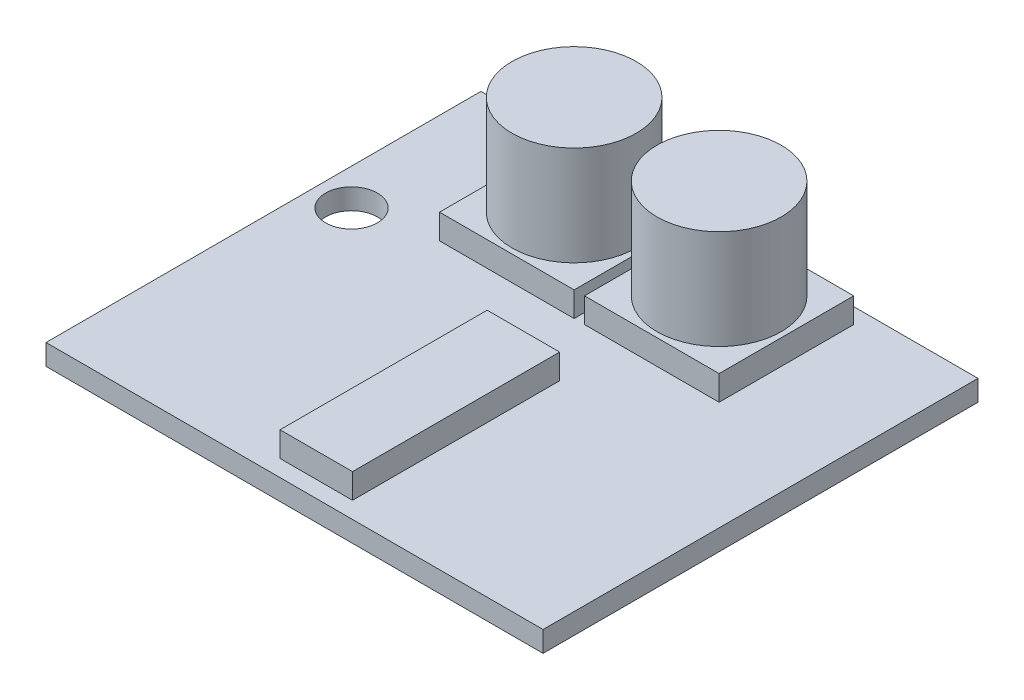
ISO-10303-21;
HEADER;
FILE_DESCRIPTION(('STEP AP214'),'2;1');
FILE_NAME('part.step','',(''),(''),'','','');
FILE_SCHEMA(('AUTOMOTIVE_DESIGN { 1 0 10303 214 1 1 1 1 }'));
ENDSEC;
DATA;
#1=APPLICATION_CONTEXT('core data for automotive mechanical design processes');
#2=APPLICATION_PROTOCOL_DEFINITION('international standard','automotive_design',2000,#1);
#3=PRODUCT_CONTEXT('',#1,'mechanical');
#4=PRODUCT('Part','Part','',(#3));
#5=PRODUCT_RELATED_PRODUCT_CATEGORY('part','',(#4));
#6=PRODUCT_DEFINITION_FORMATION('','',#4);
#7=PRODUCT_DEFINITION_CONTEXT('part definition',#1,'design');
#8=PRODUCT_DEFINITION('design','',#6,#7);
#9=PRODUCT_DEFINITION_SHAPE('','',#8);
#10=(LENGTH_UNIT() NAMED_UNIT(*) SI_UNIT(.MILLI.,.METRE.));
#11=(NAMED_UNIT(*) PLANE_ANGLE_UNIT() SI_UNIT($,.RADIAN.));
#12=(NAMED_UNIT(*) SI_UNIT($,.STERADIAN.) SOLID_ANGLE_UNIT());
#13=UNCERTAINTY_MEASURE_WITH_UNIT(LENGTH_MEASURE(1.E-05),#10,'distance_accuracy_value','');
#14=(GEOMETRIC_REPRESENTATION_CONTEXT(3) GLOBAL_UNCERTAINTY_ASSIGNED_CONTEXT((#13)) GLOBAL_UNIT_ASSIGNED_CONTEXT((#10,
#11,#12)) REPRESENTATION_CONTEXT('',''));
#15=CARTESIAN_POINT('',(0.,0.,0.));
#16=DIRECTION('',(0.,0.,1.));
#17=DIRECTION('',(1.,0.,0.));
#18=AXIS2_PLACEMENT_3D('',#15,#16,#17);
#19=CARTESIAN_POINT('',(0.,1.,0.));
#20=DIRECTION('',(0.,1.,0.));
#21=DIRECTION('',(0.,0.,1.));
#22=AXIS2_PLACEMENT_3D('',#19,#20,#21);
#23=PLANE('',#22);
#24=DIRECTION('',(1.,0.,0.));
#25=VECTOR('',#24,1.);
#26=CARTESIAN_POINT('',(-0.250000000000006,1.,-3.25));
#27=LINE('',#26,#25);
#28=CARTESIAN_POINT('',(-6.75000000000001,1.,-3.25));
#29=VERTEX_POINT('',#28);
#30=CARTESIAN_POINT('',(-0.250000000000006,1.,-3.25));
#31=VERTEX_POINT('',#30);
#32=EDGE_CURVE('E247',#29,#31,#27,.T.);
#33=ORIENTED_EDGE('',*,*,#32,.F.);
#34=DIRECTION('',(0.,0.,1.));
#35=VECTOR('',#34,1.);
#36=CARTESIAN_POINT('',(-6.75000000000001,1.,-3.25));
#37=LINE('',#36,#35);
#38=CARTESIAN_POINT('',(-6.75000000000001,1.,-9.75));
#39=VERTEX_POINT('',#38);
#40=EDGE_CURVE('E243',#39,#29,#37,.T.);
#41=ORIENTED_EDGE('',*,*,#40,.F.);
#42=DIRECTION('',(-1.,0.,0.));
#43=VECTOR('',#42,1.);
#44=CARTESIAN_POINT('',(-0.250000000000006,1.,-9.75));
#45=LINE('',#44,#43);
#46=CARTESIAN_POINT('',(-0.250000000000006,1.,-9.75));
#47=VERTEX_POINT('',#46);
#48=EDGE_CURVE('E233',#47,#39,#45,.T.);
#49=ORIENTED_EDGE('',*,*,#48,.F.);
#50=DIRECTION('',(0.,0.,-1.));
#51=VECTOR('',#50,1.);
#52=CARTESIAN_POINT('',(-0.250000000000006,1.,-3.25));
#53=LINE('',#52,#51);
#54=EDGE_CURVE('E250',#31,#47,#53,.T.);
#55=ORIENTED_EDGE('',*,*,#54,.F.);
#56=EDGE_LOOP('',(#33,#41,#49,#55));
#57=FACE_BOUND('',#56,.T.);
#58=DIRECTION('',(0.,0.,1.));
#59=VECTOR('',#58,1.);
#60=CARTESIAN_POINT('',(-12.,1.,10.5));
#61=LINE('',#60,#59);
#62=CARTESIAN_POINT('',(-12.,1.,-10.5));
#63=VERTEX_POINT('',#62);
#64=CARTESIAN_POINT('',(-12.,1.,10.5));
#65=VERTEX_POINT('',#64);
#66=EDGE_CURVE('E287',#63,#65,#61,.T.);
#67=ORIENTED_EDGE('',*,*,#66,.T.);
#68=DIRECTION('',(1.,0.,0.));
#69=VECTOR('',#68,1.);
#70=CARTESIAN_POINT('',(12.,1.,10.5));
#71=LINE('',#70,#69);
#72=CARTESIAN_POINT('',(12.,1.,10.5));
#73=VERTEX_POINT('',#72);
#74=EDGE_CURVE('E291',#65,#73,#71,.T.);
#75=ORIENTED_EDGE('',*,*,#74,.T.);
#76=DIRECTION('',(0.,0.,-1.));
#77=VECTOR('',#76,1.);
#78=CARTESIAN_POINT('',(12.,1.,10.5));
#79=LINE('',#78,#77);
#80=CARTESIAN_POINT('',(12.,1.,-10.5));
#81=VERTEX_POINT('',#80);
#82=EDGE_CURVE('E295',#73,#81,#79,.T.);
#83=ORIENTED_EDGE('',*,*,#82,.T.);
#84=DIRECTION('',(-1.,0.,0.));
#85=VECTOR('',#84,1.);
#86=CARTESIAN_POINT('',(12.,1.,-10.5));
#87=LINE('',#86,#85);
#88=EDGE_CURVE('E298',#81,#63,#87,.T.);
#89=ORIENTED_EDGE('',*,*,#88,.T.);
#90=EDGE_LOOP('',(#67,#75,#83,#89));
#91=FACE_BOUND('',#90,.T.);
#92=CARTESIAN_POINT('',(-10.25,1.,-2.5));
#93=DIRECTION('',(0.,1.,0.));
#94=DIRECTION('',(0.,0.,1.));
#95=AXIS2_PLACEMENT_3D('',#92,#93,#94);
#96=CIRCLE('',#95,1.25);
#97=CARTESIAN_POINT('',(-10.25,1.,-1.25));
#98=VERTEX_POINT('',#97);
#99=EDGE_CURVE('E279',#98,#98,#96,.T.);
#100=ORIENTED_EDGE('',*,*,#99,.F.);
#101=EDGE_LOOP('',(#100));
#102=FACE_BOUND('',#101,.T.);
#103=DIRECTION('',(1.,0.,0.));
#104=VECTOR('',#103,1.);
#105=CARTESIAN_POINT('',(6.74999999999999,1.,-3.25));
#106=LINE('',#105,#104);
#107=CARTESIAN_POINT('',(0.249999999999995,1.,-3.25));
#108=VERTEX_POINT('',#107);
#109=CARTESIAN_POINT('',(6.74999999999999,1.,-3.25));
#110=VERTEX_POINT('',#109);
#111=EDGE_CURVE('E189',#108,#110,#106,.T.);
#112=ORIENTED_EDGE('',*,*,#111,.F.);
#113=DIRECTION('',(0.,0.,1.));
#114=VECTOR('',#113,1.);
#115=CARTESIAN_POINT('',(0.249999999999995,1.,-3.25));
#116=LINE('',#115,#114);
#117=CARTESIAN_POINT('',(0.249999999999995,1.,-9.75));
#118=VERTEX_POINT('',#117);
#119=EDGE_CURVE('E184',#118,#108,#116,.T.);
#120=ORIENTED_EDGE('',*,*,#119,.F.);
#121=DIRECTION('',(-1.,0.,0.));
#122=VECTOR('',#121,1.);
#123=CARTESIAN_POINT('',(6.74999999999999,1.,-9.75));
#124=LINE('',#123,#122);
#125=CARTESIAN_POINT('',(6.74999999999999,1.,-9.75));
#126=VERTEX_POINT('',#125);
#127=EDGE_CURVE('E199',#126,#118,#124,.T.);
#128=ORIENTED_EDGE('',*,*,#127,.F.);
#129=DIRECTION('',(0.,0.,-1.));
#130=VECTOR('',#129,1.);
#131=CARTESIAN_POINT('',(6.74999999999999,1.,-3.25));
#132=LINE('',#131,#130);
#133=EDGE_CURVE('E211',#110,#126,#132,.T.);
#134=ORIENTED_EDGE('',*,*,#133,.F.);
#135=EDGE_LOOP('',(#112,#120,#128,#134));
#136=FACE_BOUND('',#135,.T.);
#137=DIRECTION('',(1.,0.,0.));
#138=VECTOR('',#137,1.);
#139=CARTESIAN_POINT('',(-1.5,1.,9.7));
#140=LINE('',#139,#138);
#141=CARTESIAN_POINT('',(-1.5,1.,9.7));
#142=VERTEX_POINT('',#141);
#143=CARTESIAN_POINT('',(2.,1.,9.7));
#144=VERTEX_POINT('',#143);
#145=EDGE_CURVE('E368',#142,#144,#140,.T.);
#146=ORIENTED_EDGE('',*,*,#145,.F.);
#147=DIRECTION('',(0.,0.,1.));
#148=VECTOR('',#147,1.);
#149=CARTESIAN_POINT('',(-1.5,1.,9.7));
#150=LINE('',#149,#148);
#151=CARTESIAN_POINT('',(-1.5,1.,-0.299999999999998));
#152=VERTEX_POINT('',#151);
#153=EDGE_CURVE('E181',#152,#142,#150,.T.);
#154=ORIENTED_EDGE('',*,*,#153,.F.);
#155=DIRECTION('',(-1.,0.,0.));
#156=VECTOR('',#155,1.);
#157=CARTESIAN_POINT('',(-1.5,1.,-0.299999999999998));
#158=LINE('',#157,#156);
#159=CARTESIAN_POINT('',(2.,1.,-0.299999999999998));
#160=VERTEX_POINT('',#159);
#161=EDGE_CURVE('E177',#160,#152,#158,.T.);
#162=ORIENTED_EDGE('',*,*,#161,.F.);
#163=DIRECTION('',(0.,0.,-1.));
#164=VECTOR('',#163,1.);
#165=CARTESIAN_POINT('',(2.,1.,9.7));
#166=LINE('',#165,#164);
#167=EDGE_CURVE('E370',#144,#160,#166,.T.);
#168=ORIENTED_EDGE('',*,*,#167,.F.);
#169=EDGE_LOOP('',(#146,#154,#162,#168));
#170=FACE_BOUND('',#169,.T.);
#171=ADVANCED_FACE('F39',(#57,#91,#102,#136,#170),#23,.T.);
#172=CARTESIAN_POINT('',(0.,0.,0.));
#173=DIRECTION('',(0.,1.,0.));
#174=DIRECTION('',(0.,0.,1.));
#175=AXIS2_PLACEMENT_3D('',#172,#173,#174);
#176=PLANE('',#175);
#177=DIRECTION('',(0.,0.,1.));
#178=VECTOR('',#177,1.);
#179=CARTESIAN_POINT('',(-12.,0.,10.5));
#180=LINE('',#179,#178);
#181=CARTESIAN_POINT('',(-12.,0.,-10.5));
#182=VERTEX_POINT('',#181);
#183=CARTESIAN_POINT('',(-12.,0.,10.5));
#184=VERTEX_POINT('',#183);
#185=EDGE_CURVE('E283',#182,#184,#180,.T.);
#186=ORIENTED_EDGE('',*,*,#185,.F.);
#187=DIRECTION('',(-1.,0.,0.));
#188=VECTOR('',#187,1.);
#189=CARTESIAN_POINT('',(12.,0.,-10.5));
#190=LINE('',#189,#188);
#191=CARTESIAN_POINT('',(12.,0.,-10.5));
#192=VERTEX_POINT('',#191);
#193=EDGE_CURVE('E292',#192,#182,#190,.T.);
#194=ORIENTED_EDGE('',*,*,#193,.F.);
#195=DIRECTION('',(0.,0.,-1.));
#196=VECTOR('',#195,1.);
#197=CARTESIAN_POINT('',(12.,0.,10.5));
#198=LINE('',#197,#196);
#199=CARTESIAN_POINT('',(12.,0.,10.5));
#200=VERTEX_POINT('',#199);
#201=EDGE_CURVE('E308',#200,#192,#198,.T.);
#202=ORIENTED_EDGE('',*,*,#201,.F.);
#203=DIRECTION('',(1.,0.,0.));
#204=VECTOR('',#203,1.);
#205=CARTESIAN_POINT('',(12.,0.,10.5));
#206=LINE('',#205,#204);
#207=EDGE_CURVE('E305',#184,#200,#206,.T.);
#208=ORIENTED_EDGE('',*,*,#207,.F.);
#209=EDGE_LOOP('',(#186,#194,#202,#208));
#210=FACE_BOUND('',#209,.T.);
#211=CARTESIAN_POINT('',(-10.25,0.,-2.5));
#212=DIRECTION('',(0.,1.,0.));
#213=DIRECTION('',(0.,0.,1.));
#214=AXIS2_PLACEMENT_3D('',#211,#212,#213);
#215=CIRCLE('',#214,1.25);
#216=CARTESIAN_POINT('',(-10.25,0.,-1.25));
#217=VERTEX_POINT('',#216);
#218=EDGE_CURVE('E278',#217,#217,#215,.T.);
#219=ORIENTED_EDGE('',*,*,#218,.T.);
#220=EDGE_LOOP('',(#219));
#221=FACE_BOUND('',#220,.T.);
#222=ADVANCED_FACE('F356',(#210,#221),#176,.F.);
#223=CARTESIAN_POINT('',(-12.,1.,10.5));
#224=DIRECTION('',(1.,0.,0.));
#225=DIRECTION('',(0.,0.,-1.));
#226=AXIS2_PLACEMENT_3D('',#223,#224,#225);
#227=PLANE('',#226);
#228=ORIENTED_EDGE('',*,*,#185,.T.);
#229=DIRECTION('',(0.,-1.,0.));
#230=VECTOR('',#229,1.);
#231=CARTESIAN_POINT('',(-12.,1.,10.5));
#232=LINE('',#231,#230);
#233=EDGE_CURVE('E11',#65,#184,#232,.T.);
#234=ORIENTED_EDGE('',*,*,#233,.F.);
#235=ORIENTED_EDGE('',*,*,#66,.F.);
#236=DIRECTION('',(0.,-1.,0.));
#237=VECTOR('',#236,1.);
#238=CARTESIAN_POINT('',(-12.,1.,-10.5));
#239=LINE('',#238,#237);
#240=EDGE_CURVE('E301',#63,#182,#239,.T.);
#241=ORIENTED_EDGE('',*,*,#240,.T.);
#242=EDGE_LOOP('',(#228,#234,#235,#241));
#243=FACE_BOUND('',#242,.T.);
#244=ADVANCED_FACE('F41',(#243),#227,.F.);
#245=CARTESIAN_POINT('',(12.,1.,10.5));
#246=DIRECTION('',(0.,0.,-1.));
#247=DIRECTION('',(-1.,0.,0.));
#248=AXIS2_PLACEMENT_3D('',#245,#246,#247);
#249=PLANE('',#248);
#250=ORIENTED_EDGE('',*,*,#207,.T.);
#251=DIRECTION('',(0.,-1.,0.));
#252=VECTOR('',#251,1.);
#253=CARTESIAN_POINT('',(12.,1.,10.5));
#254=LINE('',#253,#252);
#255=EDGE_CURVE('E49',#73,#200,#254,.T.);
#256=ORIENTED_EDGE('',*,*,#255,.F.);
#257=ORIENTED_EDGE('',*,*,#74,.F.);
#258=ORIENTED_EDGE('',*,*,#233,.T.);
#259=EDGE_LOOP('',(#250,#256,#257,#258));
#260=FACE_BOUND('',#259,.T.);
#261=ADVANCED_FACE('F456',(#260),#249,.F.);
#262=CARTESIAN_POINT('',(12.,1.,10.5));
#263=DIRECTION('',(-1.,0.,0.));
#264=DIRECTION('',(0.,0.,1.));
#265=AXIS2_PLACEMENT_3D('',#262,#263,#264);
#266=PLANE('',#265);
#267=ORIENTED_EDGE('',*,*,#201,.T.);
#268=DIRECTION('',(0.,-1.,0.));
#269=VECTOR('',#268,1.);
#270=CARTESIAN_POINT('',(12.,1.,-10.5));
#271=LINE('',#270,#269);
#272=EDGE_CURVE('E316',#81,#192,#271,.T.);
#273=ORIENTED_EDGE('',*,*,#272,.F.);
#274=ORIENTED_EDGE('',*,*,#82,.F.);
#275=ORIENTED_EDGE('',*,*,#255,.T.);
#276=EDGE_LOOP('',(#267,#273,#274,#275));
#277=FACE_BOUND('',#276,.T.);
#278=ADVANCED_FACE('F453',(#277),#266,.F.);
#279=CARTESIAN_POINT('',(12.,1.,-10.5));
#280=DIRECTION('',(0.,0.,1.));
#281=DIRECTION('',(1.,0.,0.));
#282=AXIS2_PLACEMENT_3D('',#279,#280,#281);
#283=PLANE('',#282);
#284=ORIENTED_EDGE('',*,*,#193,.T.);
#285=ORIENTED_EDGE('',*,*,#240,.F.);
#286=ORIENTED_EDGE('',*,*,#88,.F.);
#287=ORIENTED_EDGE('',*,*,#272,.T.);
#288=EDGE_LOOP('',(#284,#285,#286,#287));
#289=FACE_BOUND('',#288,.T.);
#290=ADVANCED_FACE('F445',(#289),#283,.F.);
#291=CARTESIAN_POINT('',(-10.25,1.,-2.5));
#292=DIRECTION('',(0.,-1.,0.));
#293=DIRECTION('',(0.,0.,-1.));
#294=AXIS2_PLACEMENT_3D('',#291,#292,#293);
#295=CYLINDRICAL_SURFACE('',#294,1.25);
#296=ORIENTED_EDGE('',*,*,#99,.T.);
#297=EDGE_LOOP('',(#296));
#298=FACE_BOUND('',#297,.T.);
#299=ORIENTED_EDGE('',*,*,#218,.F.);
#300=EDGE_LOOP('',(#299));
#301=FACE_BOUND('',#300,.T.);
#302=ADVANCED_FACE('F432',(#298,#301),#295,.F.);
#303=CARTESIAN_POINT('',(-6.75000000000001,2.2,-3.25));
#304=DIRECTION('',(1.,0.,0.));
#305=DIRECTION('',(0.,0.,-1.));
#306=AXIS2_PLACEMENT_3D('',#303,#304,#305);
#307=PLANE('',#306);
#308=ORIENTED_EDGE('',*,*,#40,.T.);
#309=DIRECTION('',(0.,-1.,0.));
#310=VECTOR('',#309,1.);
#311=CARTESIAN_POINT('',(-6.75000000000001,2.2,-3.25));
#312=LINE('',#311,#310);
#313=CARTESIAN_POINT('',(-6.75000000000001,2.2,-3.25));
#314=VERTEX_POINT('',#313);
#315=EDGE_CURVE('E266',#314,#29,#312,.T.);
#316=ORIENTED_EDGE('',*,*,#315,.F.);
#317=DIRECTION('',(0.,0.,1.));
#318=VECTOR('',#317,1.);
#319=CARTESIAN_POINT('',(-6.75000000000001,2.2,-3.25));
#320=LINE('',#319,#318);
#321=CARTESIAN_POINT('',(-6.75000000000001,2.2,-9.75));
#322=VERTEX_POINT('',#321);
#323=EDGE_CURVE('E228',#322,#314,#320,.T.);
#324=ORIENTED_EDGE('',*,*,#323,.F.);
#325=DIRECTION('',(0.,-1.,0.));
#326=VECTOR('',#325,1.);
#327=CARTESIAN_POINT('',(-6.75000000000001,2.2,-9.75));
#328=LINE('',#327,#326);
#329=EDGE_CURVE('E242',#322,#39,#328,.T.);
#330=ORIENTED_EDGE('',*,*,#329,.T.);
#331=EDGE_LOOP('',(#308,#316,#324,#330));
#332=FACE_BOUND('',#331,.T.);
#333=ADVANCED_FACE('F341',(#332),#307,.F.);
#334=CARTESIAN_POINT('',(-0.250000000000006,2.2,-3.25));
#335=DIRECTION('',(0.,0.,-1.));
#336=DIRECTION('',(-1.,0.,0.));
#337=AXIS2_PLACEMENT_3D('',#334,#335,#336);
#338=PLANE('',#337);
#339=ORIENTED_EDGE('',*,*,#32,.T.);
#340=DIRECTION('',(0.,-1.,0.));
#341=VECTOR('',#340,1.);
#342=CARTESIAN_POINT('',(-0.250000000000006,2.2,-3.25));
#343=LINE('',#342,#341);
#344=CARTESIAN_POINT('',(-0.250000000000006,2.2,-3.25));
#345=VERTEX_POINT('',#344);
#346=EDGE_CURVE('E262',#345,#31,#343,.T.);
#347=ORIENTED_EDGE('',*,*,#346,.F.);
#348=DIRECTION('',(1.,0.,0.));
#349=VECTOR('',#348,1.);
#350=CARTESIAN_POINT('',(-0.250000000000006,2.2,-3.25));
#351=LINE('',#350,#349);
#352=EDGE_CURVE('E232',#314,#345,#351,.T.);
#353=ORIENTED_EDGE('',*,*,#352,.F.);
#354=ORIENTED_EDGE('',*,*,#315,.T.);
#355=EDGE_LOOP('',(#339,#347,#353,#354));
#356=FACE_BOUND('',#355,.T.);
#357=ADVANCED_FACE('F345',(#356),#338,.F.);
#358=CARTESIAN_POINT('',(-0.250000000000006,2.2,-3.25));
#359=DIRECTION('',(-1.,0.,0.));
#360=DIRECTION('',(0.,0.,1.));
#361=AXIS2_PLACEMENT_3D('',#358,#359,#360);
#362=PLANE('',#361);
#363=ORIENTED_EDGE('',*,*,#54,.T.);
#364=DIRECTION('',(0.,-1.,0.));
#365=VECTOR('',#364,1.);
#366=CARTESIAN_POINT('',(-0.250000000000006,2.2,-9.75));
#367=LINE('',#366,#365);
#368=CARTESIAN_POINT('',(-0.250000000000006,2.2,-9.75));
#369=VERTEX_POINT('',#368);
#370=EDGE_CURVE('E259',#369,#47,#367,.T.);
#371=ORIENTED_EDGE('',*,*,#370,.F.);
#372=DIRECTION('',(0.,0.,-1.));
#373=VECTOR('',#372,1.);
#374=CARTESIAN_POINT('',(-0.250000000000006,2.2,-3.25));
#375=LINE('',#374,#373);
#376=EDGE_CURVE('E236',#345,#369,#375,.T.);
#377=ORIENTED_EDGE('',*,*,#376,.F.);
#378=ORIENTED_EDGE('',*,*,#346,.T.);
#379=EDGE_LOOP('',(#363,#371,#377,#378));
#380=FACE_BOUND('',#379,.T.);
#381=ADVANCED_FACE('F350',(#380),#362,.F.);
#382=CARTESIAN_POINT('',(-0.250000000000006,2.2,-9.75));
#383=DIRECTION('',(0.,0.,1.));
#384=DIRECTION('',(1.,0.,0.));
#385=AXIS2_PLACEMENT_3D('',#382,#383,#384);
#386=PLANE('',#385);
#387=ORIENTED_EDGE('',*,*,#48,.T.);
#388=ORIENTED_EDGE('',*,*,#329,.F.);
#389=DIRECTION('',(-1.,0.,0.));
#390=VECTOR('',#389,1.);
#391=CARTESIAN_POINT('',(-0.250000000000006,2.2,-9.75));
#392=LINE('',#391,#390);
#393=EDGE_CURVE('E239',#369,#322,#392,.T.);
#394=ORIENTED_EDGE('',*,*,#393,.F.);
#395=ORIENTED_EDGE('',*,*,#370,.T.);
#396=EDGE_LOOP('',(#387,#388,#394,#395));
#397=FACE_BOUND('',#396,.T.);
#398=ADVANCED_FACE('F333',(#397),#386,.F.);
#399=CARTESIAN_POINT('',(0.,2.2,0.));
#400=DIRECTION('',(0.,1.,0.));
#401=DIRECTION('',(0.,0.,1.));
#402=AXIS2_PLACEMENT_3D('',#399,#400,#401);
#403=PLANE('',#402);
#404=CARTESIAN_POINT('',(-3.50000000000001,2.2,-6.5));
#405=DIRECTION('',(0.,1.,0.));
#406=DIRECTION('',(0.,0.,1.));
#407=AXIS2_PLACEMENT_3D('',#404,#405,#406);
#408=CIRCLE('',#407,3.);
#409=CARTESIAN_POINT('',(-3.50000000000001,2.2,-3.5));
#410=VERTEX_POINT('',#409);
#411=EDGE_CURVE('E269',#410,#410,#408,.T.);
#412=ORIENTED_EDGE('',*,*,#411,.F.);
#413=EDGE_LOOP('',(#412));
#414=FACE_BOUND('',#413,.T.);
#415=ORIENTED_EDGE('',*,*,#323,.T.);
#416=ORIENTED_EDGE('',*,*,#352,.T.);
#417=ORIENTED_EDGE('',*,*,#376,.T.);
#418=ORIENTED_EDGE('',*,*,#393,.T.);
#419=EDGE_LOOP('',(#415,#416,#417,#418));
#420=FACE_BOUND('',#419,.T.);
#421=ADVANCED_FACE('F329',(#414,#420),#403,.T.);
#422=CARTESIAN_POINT('',(-3.50000000000001,7.,-6.5));
#423=DIRECTION('',(0.,1.,0.));
#424=DIRECTION('',(0.,0.,1.));
#425=AXIS2_PLACEMENT_3D('',#422,#423,#424);
#426=PLANE('',#425);
#427=CARTESIAN_POINT('',(-3.50000000000001,7.,-6.5));
#428=DIRECTION('',(0.,1.,0.));
#429=DIRECTION('',(0.,0.,1.));
#430=AXIS2_PLACEMENT_3D('',#427,#428,#429);
#431=CIRCLE('',#430,3.);
#432=CARTESIAN_POINT('',(-3.50000000000001,7.,-3.5));
#433=VERTEX_POINT('',#432);
#434=EDGE_CURVE('E270',#433,#433,#431,.T.);
#435=ORIENTED_EDGE('',*,*,#434,.T.);
#436=EDGE_LOOP('',(#435));
#437=FACE_BOUND('',#436,.T.);
#438=ADVANCED_FACE('F332',(#437),#426,.T.);
#439=CARTESIAN_POINT('',(-3.50000000000001,7.,-6.5));
#440=DIRECTION('',(0.,-1.,0.));
#441=DIRECTION('',(0.,0.,-1.));
#442=AXIS2_PLACEMENT_3D('',#439,#440,#441);
#443=CYLINDRICAL_SURFACE('',#442,3.);
#444=ORIENTED_EDGE('',*,*,#411,.T.);
#445=EDGE_LOOP('',(#444));
#446=FACE_BOUND('',#445,.T.);
#447=ORIENTED_EDGE('',*,*,#434,.F.);
#448=EDGE_LOOP('',(#447));
#449=FACE_BOUND('',#448,.T.);
#450=ADVANCED_FACE('F326',(#446,#449),#443,.T.);
#451=CARTESIAN_POINT('',(0.249999999999995,2.2,-3.25));
#452=DIRECTION('',(1.,0.,0.));
#453=DIRECTION('',(0.,0.,-1.));
#454=AXIS2_PLACEMENT_3D('',#451,#452,#453);
#455=PLANE('',#454);
#456=ORIENTED_EDGE('',*,*,#119,.T.);
#457=DIRECTION('',(0.,-1.,0.));
#458=VECTOR('',#457,1.);
#459=CARTESIAN_POINT('',(0.249999999999995,2.2,-3.25));
#460=LINE('',#459,#458);
#461=CARTESIAN_POINT('',(0.249999999999995,2.2,-3.25));
#462=VERTEX_POINT('',#461);
#463=EDGE_CURVE('E225',#462,#108,#460,.T.);
#464=ORIENTED_EDGE('',*,*,#463,.F.);
#465=DIRECTION('',(0.,0.,1.));
#466=VECTOR('',#465,1.);
#467=CARTESIAN_POINT('',(0.249999999999995,2.2,-3.25));
#468=LINE('',#467,#466);
#469=CARTESIAN_POINT('',(0.249999999999995,2.2,-9.75));
#470=VERTEX_POINT('',#469);
#471=EDGE_CURVE('E194',#470,#462,#468,.T.);
#472=ORIENTED_EDGE('',*,*,#471,.F.);
#473=DIRECTION('',(0.,-1.,0.));
#474=VECTOR('',#473,1.);
#475=CARTESIAN_POINT('',(0.249999999999995,2.2,-9.75));
#476=LINE('',#475,#474);
#477=EDGE_CURVE('E207',#470,#118,#476,.T.);
#478=ORIENTED_EDGE('',*,*,#477,.T.);
#479=EDGE_LOOP('',(#456,#464,#472,#478));
#480=FACE_BOUND('',#479,.T.);
#481=ADVANCED_FACE('F419',(#480),#455,.F.);
#482=CARTESIAN_POINT('',(6.74999999999999,2.2,-3.25));
#483=DIRECTION('',(0.,0.,-1.));
#484=DIRECTION('',(-1.,0.,0.));
#485=AXIS2_PLACEMENT_3D('',#482,#483,#484);
#486=PLANE('',#485);
#487=ORIENTED_EDGE('',*,*,#111,.T.);
#488=DIRECTION('',(0.,-1.,0.));
#489=VECTOR('',#488,1.);
#490=CARTESIAN_POINT('',(6.74999999999999,2.2,-3.25));
#491=LINE('',#490,#489);
#492=CARTESIAN_POINT('',(6.74999999999999,2.2,-3.25));
#493=VERTEX_POINT('',#492);
#494=EDGE_CURVE('E221',#493,#110,#491,.T.);
#495=ORIENTED_EDGE('',*,*,#494,.F.);
#496=DIRECTION('',(1.,0.,0.));
#497=VECTOR('',#496,1.);
#498=CARTESIAN_POINT('',(6.74999999999999,2.2,-3.25));
#499=LINE('',#498,#497);
#500=EDGE_CURVE('E198',#462,#493,#499,.T.);
#501=ORIENTED_EDGE('',*,*,#500,.F.);
#502=ORIENTED_EDGE('',*,*,#463,.T.);
#503=EDGE_LOOP('',(#487,#495,#501,#502));
#504=FACE_BOUND('',#503,.T.);
#505=ADVANCED_FACE('F415',(#504),#486,.F.);
#506=CARTESIAN_POINT('',(6.74999999999999,2.2,-3.25));
#507=DIRECTION('',(-1.,0.,0.));
#508=DIRECTION('',(0.,0.,1.));
#509=AXIS2_PLACEMENT_3D('',#506,#507,#508);
#510=PLANE('',#509);
#511=ORIENTED_EDGE('',*,*,#133,.T.);
#512=DIRECTION('',(0.,-1.,0.));
#513=VECTOR('',#512,1.);
#514=CARTESIAN_POINT('',(6.74999999999999,2.2,-9.75));
#515=LINE('',#514,#513);
#516=CARTESIAN_POINT('',(6.74999999999999,2.2,-9.75));
#517=VERTEX_POINT('',#516);
#518=EDGE_CURVE('E65',#517,#126,#515,.T.);
#519=ORIENTED_EDGE('',*,*,#518,.F.);
#520=DIRECTION('',(0.,0.,-1.));
#521=VECTOR('',#520,1.);
#522=CARTESIAN_POINT('',(6.74999999999999,2.2,-3.25));
#523=LINE('',#522,#521);
#524=EDGE_CURVE('E202',#493,#517,#523,.T.);
#525=ORIENTED_EDGE('',*,*,#524,.F.);
#526=ORIENTED_EDGE('',*,*,#494,.T.);
#527=EDGE_LOOP('',(#511,#519,#525,#526));
#528=FACE_BOUND('',#527,.T.);
#529=ADVANCED_FACE('F412',(#528),#510,.F.);
#530=CARTESIAN_POINT('',(6.74999999999999,2.2,-9.75));
#531=DIRECTION('',(0.,0.,1.));
#532=DIRECTION('',(1.,0.,0.));
#533=AXIS2_PLACEMENT_3D('',#530,#531,#532);
#534=PLANE('',#533);
#535=ORIENTED_EDGE('',*,*,#127,.T.);
#536=ORIENTED_EDGE('',*,*,#477,.F.);
#537=DIRECTION('',(-1.,0.,0.));
#538=VECTOR('',#537,1.);
#539=CARTESIAN_POINT('',(6.74999999999999,2.2,-9.75));
#540=LINE('',#539,#538);
#541=EDGE_CURVE('E205',#517,#470,#540,.T.);
#542=ORIENTED_EDGE('',*,*,#541,.F.);
#543=ORIENTED_EDGE('',*,*,#518,.T.);
#544=EDGE_LOOP('',(#535,#536,#542,#543));
#545=FACE_BOUND('',#544,.T.);
#546=ADVANCED_FACE('F408',(#545),#534,.F.);
#547=CARTESIAN_POINT('',(0.,2.2,0.));
#548=DIRECTION('',(0.,1.,0.));
#549=DIRECTION('',(0.,0.,1.));
#550=AXIS2_PLACEMENT_3D('',#547,#548,#549);
#551=PLANE('',#550);
#552=CARTESIAN_POINT('',(3.49999999999999,2.2,-6.5));
#553=DIRECTION('',(0.,1.,0.));
#554=DIRECTION('',(0.,0.,1.));
#555=AXIS2_PLACEMENT_3D('',#552,#553,#554);
#556=CIRCLE('',#555,3.);
#557=CARTESIAN_POINT('',(3.49999999999999,2.2,-3.5));
#558=VERTEX_POINT('',#557);
#559=EDGE_CURVE('E43',#558,#558,#556,.T.);
#560=ORIENTED_EDGE('',*,*,#559,.F.);
#561=EDGE_LOOP('',(#560));
#562=FACE_BOUND('',#561,.T.);
#563=ORIENTED_EDGE('',*,*,#471,.T.);
#564=ORIENTED_EDGE('',*,*,#500,.T.);
#565=ORIENTED_EDGE('',*,*,#524,.T.);
#566=ORIENTED_EDGE('',*,*,#541,.T.);
#567=EDGE_LOOP('',(#563,#564,#565,#566));
#568=FACE_BOUND('',#567,.T.);
#569=ADVANCED_FACE('F404',(#562,#568),#551,.T.);
#570=CARTESIAN_POINT('',(3.49999999999999,7.,-6.5));
#571=DIRECTION('',(0.,1.,0.));
#572=DIRECTION('',(0.,0.,1.));
#573=AXIS2_PLACEMENT_3D('',#570,#571,#572);
#574=PLANE('',#573);
#575=CARTESIAN_POINT('',(3.49999999999999,7.,-6.5));
#576=DIRECTION('',(0.,1.,0.));
#577=DIRECTION('',(0.,0.,1.));
#578=AXIS2_PLACEMENT_3D('',#575,#576,#577);
#579=CIRCLE('',#578,3.);
#580=CARTESIAN_POINT('',(3.49999999999999,7.,-3.5));
#581=VERTEX_POINT('',#580);
#582=EDGE_CURVE('E274',#581,#581,#579,.T.);
#583=ORIENTED_EDGE('',*,*,#582,.T.);
#584=EDGE_LOOP('',(#583));
#585=FACE_BOUND('',#584,.T.);
#586=ADVANCED_FACE('F407',(#585),#574,.T.);
#587=CARTESIAN_POINT('',(3.49999999999999,7.,-6.5));
#588=DIRECTION('',(0.,-1.,0.));
#589=DIRECTION('',(0.,0.,-1.));
#590=AXIS2_PLACEMENT_3D('',#587,#588,#589);
#591=CYLINDRICAL_SURFACE('',#590,3.);
#592=ORIENTED_EDGE('',*,*,#559,.T.);
#593=EDGE_LOOP('',(#592));
#594=FACE_BOUND('',#593,.T.);
#595=ORIENTED_EDGE('',*,*,#582,.F.);
#596=EDGE_LOOP('',(#595));
#597=FACE_BOUND('',#596,.T.);
#598=ADVANCED_FACE('F403',(#594,#597),#591,.T.);
#599=CARTESIAN_POINT('',(-1.5,2.2,9.7));
#600=DIRECTION('',(1.,0.,0.));
#601=DIRECTION('',(0.,0.,-1.));
#602=AXIS2_PLACEMENT_3D('',#599,#600,#601);
#603=PLANE('',#602);
#604=ORIENTED_EDGE('',*,*,#153,.T.);
#605=DIRECTION('',(0.,-1.,0.));
#606=VECTOR('',#605,1.);
#607=CARTESIAN_POINT('',(-1.5,2.2,9.7));
#608=LINE('',#607,#606);
#609=CARTESIAN_POINT('',(-1.5,2.2,9.7));
#610=VERTEX_POINT('',#609);
#611=EDGE_CURVE('E160',#610,#142,#608,.T.);
#612=ORIENTED_EDGE('',*,*,#611,.F.);
#613=DIRECTION('',(0.,0.,1.));
#614=VECTOR('',#613,1.);
#615=CARTESIAN_POINT('',(-1.5,2.2,9.7));
#616=LINE('',#615,#614);
#617=CARTESIAN_POINT('',(-1.5,2.2,-0.299999999999998));
#618=VERTEX_POINT('',#617);
#619=EDGE_CURVE('E168',#618,#610,#616,.T.);
#620=ORIENTED_EDGE('',*,*,#619,.F.);
#621=DIRECTION('',(0.,-1.,0.));
#622=VECTOR('',#621,1.);
#623=CARTESIAN_POINT('',(-1.5,2.2,-0.299999999999998));
#624=LINE('',#623,#622);
#625=EDGE_CURVE('E381',#618,#152,#624,.T.);
#626=ORIENTED_EDGE('',*,*,#625,.T.);
#627=EDGE_LOOP('',(#604,#612,#620,#626));
#628=FACE_BOUND('',#627,.T.);
#629=ADVANCED_FACE('F179',(#628),#603,.F.);
#630=CARTESIAN_POINT('',(-1.5,2.2,9.7));
#631=DIRECTION('',(0.,0.,-1.));
#632=DIRECTION('',(-1.,0.,0.));
#633=AXIS2_PLACEMENT_3D('',#630,#631,#632);
#634=PLANE('',#633);
#635=ORIENTED_EDGE('',*,*,#145,.T.);
#636=DIRECTION('',(0.,-1.,0.));
#637=VECTOR('',#636,1.);
#638=CARTESIAN_POINT('',(2.,2.2,9.7));
#639=LINE('',#638,#637);
#640=CARTESIAN_POINT('',(2.,2.2,9.7));
#641=VERTEX_POINT('',#640);
#642=EDGE_CURVE('E163',#641,#144,#639,.T.);
#643=ORIENTED_EDGE('',*,*,#642,.F.);
#644=DIRECTION('',(1.,0.,0.));
#645=VECTOR('',#644,1.);
#646=CARTESIAN_POINT('',(-1.5,2.2,9.7));
#647=LINE('',#646,#645);
#648=EDGE_CURVE('E156',#610,#641,#647,.T.);
#649=ORIENTED_EDGE('',*,*,#648,.F.);
#650=ORIENTED_EDGE('',*,*,#611,.T.);
#651=EDGE_LOOP('',(#635,#643,#649,#650));
#652=FACE_BOUND('',#651,.T.);
#653=ADVANCED_FACE('F158',(#652),#634,.F.);
#654=CARTESIAN_POINT('',(2.,2.2,9.7));
#655=DIRECTION('',(-1.,0.,0.));
#656=DIRECTION('',(0.,0.,1.));
#657=AXIS2_PLACEMENT_3D('',#654,#655,#656);
#658=PLANE('',#657);
#659=ORIENTED_EDGE('',*,*,#167,.T.);
#660=DIRECTION('',(0.,-1.,0.));
#661=VECTOR('',#660,1.);
#662=CARTESIAN_POINT('',(2.,2.2,-0.299999999999998));
#663=LINE('',#662,#661);
#664=CARTESIAN_POINT('',(2.,2.2,-0.299999999999998));
#665=VERTEX_POINT('',#664);
#666=EDGE_CURVE('E57',#665,#160,#663,.T.);
#667=ORIENTED_EDGE('',*,*,#666,.F.);
#668=DIRECTION('',(0.,0.,-1.));
#669=VECTOR('',#668,1.);
#670=CARTESIAN_POINT('',(2.,2.2,9.7));
#671=LINE('',#670,#669);
#672=EDGE_CURVE('E167',#641,#665,#671,.T.);
#673=ORIENTED_EDGE('',*,*,#672,.F.);
#674=ORIENTED_EDGE('',*,*,#642,.T.);
#675=EDGE_LOOP('',(#659,#667,#673,#674));
#676=FACE_BOUND('',#675,.T.);
#677=ADVANCED_FACE('F388',(#676),#658,.F.);
#678=CARTESIAN_POINT('',(-1.5,2.2,-0.299999999999998));
#679=DIRECTION('',(0.,0.,1.));
#680=DIRECTION('',(1.,0.,0.));
#681=AXIS2_PLACEMENT_3D('',#678,#679,#680);
#682=PLANE('',#681);
#683=ORIENTED_EDGE('',*,*,#161,.T.);
#684=ORIENTED_EDGE('',*,*,#625,.F.);
#685=DIRECTION('',(-1.,0.,0.));
#686=VECTOR('',#685,1.);
#687=CARTESIAN_POINT('',(-1.5,2.2,-0.299999999999998));
#688=LINE('',#687,#686);
#689=EDGE_CURVE('E172',#665,#618,#688,.T.);
#690=ORIENTED_EDGE('',*,*,#689,.F.);
#691=ORIENTED_EDGE('',*,*,#666,.T.);
#692=EDGE_LOOP('',(#683,#684,#690,#691));
#693=FACE_BOUND('',#692,.T.);
#694=ADVANCED_FACE('F389',(#693),#682,.F.);
#695=CARTESIAN_POINT('',(0.,2.2,0.));
#696=DIRECTION('',(0.,-1.,0.));
#697=DIRECTION('',(0.,0.,-1.));
#698=AXIS2_PLACEMENT_3D('',#695,#696,#697);
#699=PLANE('',#698);
#700=ORIENTED_EDGE('',*,*,#619,.T.);
#701=ORIENTED_EDGE('',*,*,#648,.T.);
#702=ORIENTED_EDGE('',*,*,#672,.T.);
#703=ORIENTED_EDGE('',*,*,#689,.T.);
#704=EDGE_LOOP('',(#700,#701,#702,#703));
#705=FACE_BOUND('',#704,.T.);
#706=ADVANCED_FACE('F171',(#705),#699,.F.);
#707=CLOSED_SHELL('',(#171,#222,#244,#261,#278,#290,#302,#333,#357,#381,#398,#421,#438,#450,
#481,#505,#529,#546,#569,#586,#598,#629,#653,#677,#694,#706));
#708=MANIFOLD_SOLID_BREP('B2',#707);
#709=ADVANCED_BREP_SHAPE_REPRESENTATION('',(#18,#708),#14);
#710=SHAPE_DEFINITION_REPRESENTATION(#9,#709);
ENDSEC;
END-ISO-10303-21;
